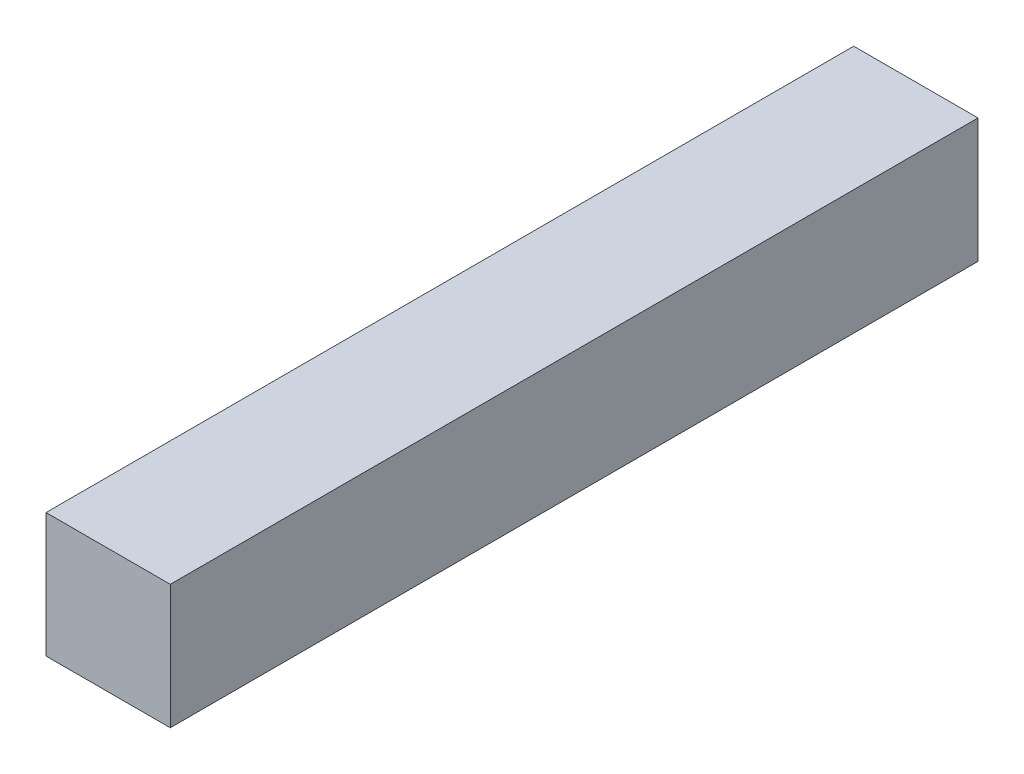
ISO-10303-21;
HEADER;
FILE_DESCRIPTION(('STEP AP214'),'2;1');
FILE_NAME('part.step','',(''),(''),'','','');
FILE_SCHEMA(('AUTOMOTIVE_DESIGN { 1 0 10303 214 1 1 1 1 }'));
ENDSEC;
DATA;
#1=APPLICATION_CONTEXT('core data for automotive mechanical design processes');
#2=APPLICATION_PROTOCOL_DEFINITION('international standard','automotive_design',2000,#1);
#3=PRODUCT_CONTEXT('',#1,'mechanical');
#4=PRODUCT('Part','Part','',(#3));
#5=PRODUCT_RELATED_PRODUCT_CATEGORY('part','',(#4));
#6=PRODUCT_DEFINITION_FORMATION('','',#4);
#7=PRODUCT_DEFINITION_CONTEXT('part definition',#1,'design');
#8=PRODUCT_DEFINITION('design','',#6,#7);
#9=PRODUCT_DEFINITION_SHAPE('','',#8);
#10=(LENGTH_UNIT() NAMED_UNIT(*) SI_UNIT(.MILLI.,.METRE.));
#11=(NAMED_UNIT(*) PLANE_ANGLE_UNIT() SI_UNIT($,.RADIAN.));
#12=(NAMED_UNIT(*) SI_UNIT($,.STERADIAN.) SOLID_ANGLE_UNIT());
#13=UNCERTAINTY_MEASURE_WITH_UNIT(LENGTH_MEASURE(1.E-05),#10,'distance_accuracy_value','');
#14=(GEOMETRIC_REPRESENTATION_CONTEXT(3) GLOBAL_UNCERTAINTY_ASSIGNED_CONTEXT((#13)) GLOBAL_UNIT_ASSIGNED_CONTEXT((#10,
#11,#12)) REPRESENTATION_CONTEXT('',''));
#15=CARTESIAN_POINT('',(0.,0.,0.));
#16=DIRECTION('',(0.,0.,1.));
#17=DIRECTION('',(1.,0.,0.));
#18=AXIS2_PLACEMENT_3D('',#15,#16,#17);
#19=CARTESIAN_POINT('',(-9.525,-9.525,123.825));
#20=DIRECTION('',(-1.,0.,0.));
#21=DIRECTION('',(0.,0.,1.));
#22=AXIS2_PLACEMENT_3D('',#19,#20,#21);
#23=PLANE('',#22);
#24=DIRECTION('',(0.,1.,0.));
#25=VECTOR('',#24,1.);
#26=CARTESIAN_POINT('',(-9.525,-9.525,0.));
#27=LINE('',#26,#25);
#28=CARTESIAN_POINT('',(-9.525,-9.525,0.));
#29=VERTEX_POINT('',#28);
#30=CARTESIAN_POINT('',(-9.525,9.525,0.));
#31=VERTEX_POINT('',#30);
#32=EDGE_CURVE('E100',#29,#31,#27,.T.);
#33=ORIENTED_EDGE('',*,*,#32,.F.);
#34=DIRECTION('',(0.,0.,-1.));
#35=VECTOR('',#34,1.);
#36=CARTESIAN_POINT('',(-9.525,-9.525,123.825));
#37=LINE('',#36,#35);
#38=CARTESIAN_POINT('',(-9.525,-9.525,123.825));
#39=VERTEX_POINT('',#38);
#40=EDGE_CURVE('E11',#39,#29,#37,.T.);
#41=ORIENTED_EDGE('',*,*,#40,.F.);
#42=DIRECTION('',(0.,1.,0.));
#43=VECTOR('',#42,1.);
#44=CARTESIAN_POINT('',(-9.525,-9.525,123.825));
#45=LINE('',#44,#43);
#46=CARTESIAN_POINT('',(-9.525,9.525,123.825));
#47=VERTEX_POINT('',#46);
#48=EDGE_CURVE('E95',#39,#47,#45,.T.);
#49=ORIENTED_EDGE('',*,*,#48,.T.);
#50=DIRECTION('',(0.,0.,-1.));
#51=VECTOR('',#50,1.);
#52=CARTESIAN_POINT('',(-9.525,9.525,123.825));
#53=LINE('',#52,#51);
#54=EDGE_CURVE('E38',#47,#31,#53,.T.);
#55=ORIENTED_EDGE('',*,*,#54,.T.);
#56=EDGE_LOOP('',(#33,#41,#49,#55));
#57=FACE_BOUND('',#56,.T.);
#58=ADVANCED_FACE('F35',(#57),#23,.T.);
#59=CARTESIAN_POINT('',(-9.525,-9.525,123.825));
#60=DIRECTION('',(0.,1.,0.));
#61=DIRECTION('',(0.,0.,1.));
#62=AXIS2_PLACEMENT_3D('',#59,#60,#61);
#63=PLANE('',#62);
#64=DIRECTION('',(1.,0.,0.));
#65=VECTOR('',#64,1.);
#66=CARTESIAN_POINT('',(-9.525,-9.525,0.));
#67=LINE('',#66,#65);
#68=CARTESIAN_POINT('',(9.525,-9.525,0.));
#69=VERTEX_POINT('',#68);
#70=EDGE_CURVE('E68',#29,#69,#67,.T.);
#71=ORIENTED_EDGE('',*,*,#70,.T.);
#72=DIRECTION('',(0.,0.,-1.));
#73=VECTOR('',#72,1.);
#74=CARTESIAN_POINT('',(9.525,-9.525,123.825));
#75=LINE('',#74,#73);
#76=CARTESIAN_POINT('',(9.525,-9.525,123.825));
#77=VERTEX_POINT('',#76);
#78=EDGE_CURVE('E44',#77,#69,#75,.T.);
#79=ORIENTED_EDGE('',*,*,#78,.F.);
#80=DIRECTION('',(1.,0.,0.));
#81=VECTOR('',#80,1.);
#82=CARTESIAN_POINT('',(-9.525,-9.525,123.825));
#83=LINE('',#82,#81);
#84=EDGE_CURVE('E85',#39,#77,#83,.T.);
#85=ORIENTED_EDGE('',*,*,#84,.F.);
#86=ORIENTED_EDGE('',*,*,#40,.T.);
#87=EDGE_LOOP('',(#71,#79,#85,#86));
#88=FACE_BOUND('',#87,.T.);
#89=ADVANCED_FACE('F110',(#88),#63,.F.);
#90=CARTESIAN_POINT('',(9.525,-9.525,123.825));
#91=DIRECTION('',(-1.,0.,0.));
#92=DIRECTION('',(0.,0.,1.));
#93=AXIS2_PLACEMENT_3D('',#90,#91,#92);
#94=PLANE('',#93);
#95=DIRECTION('',(0.,1.,0.));
#96=VECTOR('',#95,1.);
#97=CARTESIAN_POINT('',(9.525,-9.525,0.));
#98=LINE('',#97,#96);
#99=CARTESIAN_POINT('',(9.525,9.525,0.));
#100=VERTEX_POINT('',#99);
#101=EDGE_CURVE('E92',#69,#100,#98,.T.);
#102=ORIENTED_EDGE('',*,*,#101,.T.);
#103=DIRECTION('',(0.,0.,-1.));
#104=VECTOR('',#103,1.);
#105=CARTESIAN_POINT('',(9.525,9.525,123.825));
#106=LINE('',#105,#104);
#107=CARTESIAN_POINT('',(9.525,9.525,123.825));
#108=VERTEX_POINT('',#107);
#109=EDGE_CURVE('E89',#108,#100,#106,.T.);
#110=ORIENTED_EDGE('',*,*,#109,.F.);
#111=DIRECTION('',(0.,1.,0.));
#112=VECTOR('',#111,1.);
#113=CARTESIAN_POINT('',(9.525,-9.525,123.825));
#114=LINE('',#113,#112);
#115=EDGE_CURVE('E80',#77,#108,#114,.T.);
#116=ORIENTED_EDGE('',*,*,#115,.F.);
#117=ORIENTED_EDGE('',*,*,#78,.T.);
#118=EDGE_LOOP('',(#102,#110,#116,#117));
#119=FACE_BOUND('',#118,.T.);
#120=ADVANCED_FACE('F90',(#119),#94,.F.);
#121=CARTESIAN_POINT('',(-9.525,9.525,123.825));
#122=DIRECTION('',(0.,1.,0.));
#123=DIRECTION('',(0.,0.,1.));
#124=AXIS2_PLACEMENT_3D('',#121,#122,#123);
#125=PLANE('',#124);
#126=DIRECTION('',(1.,0.,0.));
#127=VECTOR('',#126,1.);
#128=CARTESIAN_POINT('',(-9.525,9.525,0.));
#129=LINE('',#128,#127);
#130=EDGE_CURVE('E103',#31,#100,#129,.T.);
#131=ORIENTED_EDGE('',*,*,#130,.F.);
#132=ORIENTED_EDGE('',*,*,#54,.F.);
#133=DIRECTION('',(1.,0.,0.));
#134=VECTOR('',#133,1.);
#135=CARTESIAN_POINT('',(-9.525,9.525,123.825));
#136=LINE('',#135,#134);
#137=EDGE_CURVE('E84',#47,#108,#136,.T.);
#138=ORIENTED_EDGE('',*,*,#137,.T.);
#139=ORIENTED_EDGE('',*,*,#109,.T.);
#140=EDGE_LOOP('',(#131,#132,#138,#139));
#141=FACE_BOUND('',#140,.T.);
#142=ADVANCED_FACE('F94',(#141),#125,.T.);
#143=CARTESIAN_POINT('',(0.,0.,123.825));
#144=DIRECTION('',(0.,0.,-1.));
#145=DIRECTION('',(-1.,0.,0.));
#146=AXIS2_PLACEMENT_3D('',#143,#144,#145);
#147=PLANE('',#146);
#148=ORIENTED_EDGE('',*,*,#48,.F.);
#149=ORIENTED_EDGE('',*,*,#84,.T.);
#150=ORIENTED_EDGE('',*,*,#115,.T.);
#151=ORIENTED_EDGE('',*,*,#137,.F.);
#152=EDGE_LOOP('',(#148,#149,#150,#151));
#153=FACE_BOUND('',#152,.T.);
#154=ADVANCED_FACE('F83',(#153),#147,.F.);
#155=CARTESIAN_POINT('',(0.,0.,0.));
#156=DIRECTION('',(0.,0.,-1.));
#157=DIRECTION('',(-1.,0.,0.));
#158=AXIS2_PLACEMENT_3D('',#155,#156,#157);
#159=PLANE('',#158);
#160=ORIENTED_EDGE('',*,*,#32,.T.);
#161=ORIENTED_EDGE('',*,*,#130,.T.);
#162=ORIENTED_EDGE('',*,*,#101,.F.);
#163=ORIENTED_EDGE('',*,*,#70,.F.);
#164=EDGE_LOOP('',(#160,#161,#162,#163));
#165=FACE_BOUND('',#164,.T.);
#166=ADVANCED_FACE('F108',(#165),#159,.T.);
#167=CLOSED_SHELL('',(#58,#89,#120,#142,#154,#166));
#168=MANIFOLD_SOLID_BREP('B2',#167);
#169=ADVANCED_BREP_SHAPE_REPRESENTATION('',(#18,#168),#14);
#170=SHAPE_DEFINITION_REPRESENTATION(#9,#169);
ENDSEC;
END-ISO-10303-21;
